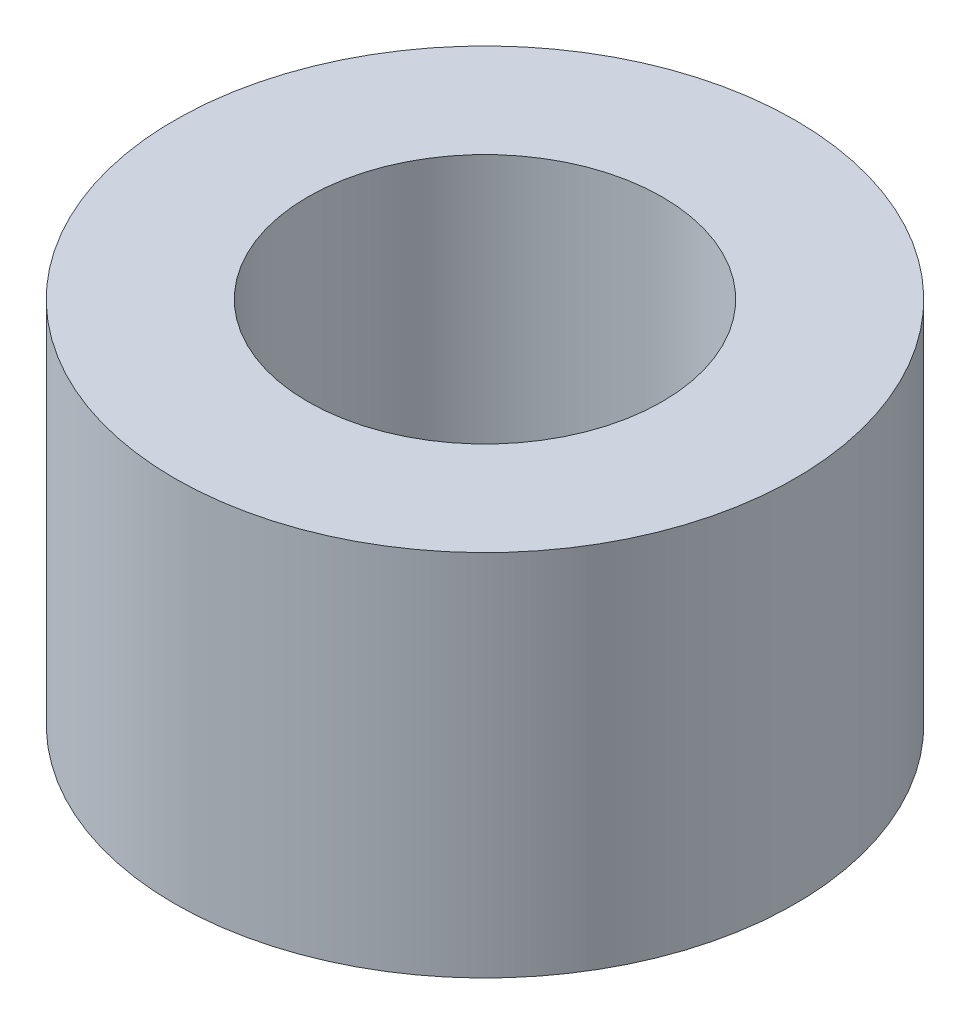
ISO-10303-21;
HEADER;
FILE_DESCRIPTION(('STEP AP214'),'2;1');
FILE_NAME('part.step','',(''),(''),'','','');
FILE_SCHEMA(('AUTOMOTIVE_DESIGN { 1 0 10303 214 1 1 1 1 }'));
ENDSEC;
DATA;
#1=APPLICATION_CONTEXT('core data for automotive mechanical design processes');
#2=APPLICATION_PROTOCOL_DEFINITION('international standard','automotive_design',2000,#1);
#3=PRODUCT_CONTEXT('',#1,'mechanical');
#4=PRODUCT('Part','Part','',(#3));
#5=PRODUCT_RELATED_PRODUCT_CATEGORY('part','',(#4));
#6=PRODUCT_DEFINITION_FORMATION('','',#4);
#7=PRODUCT_DEFINITION_CONTEXT('part definition',#1,'design');
#8=PRODUCT_DEFINITION('design','',#6,#7);
#9=PRODUCT_DEFINITION_SHAPE('','',#8);
#10=(LENGTH_UNIT() NAMED_UNIT(*) SI_UNIT(.MILLI.,.METRE.));
#11=(NAMED_UNIT(*) PLANE_ANGLE_UNIT() SI_UNIT($,.RADIAN.));
#12=(NAMED_UNIT(*) SI_UNIT($,.STERADIAN.) SOLID_ANGLE_UNIT());
#13=UNCERTAINTY_MEASURE_WITH_UNIT(LENGTH_MEASURE(1.E-05),#10,'distance_accuracy_value','');
#14=(GEOMETRIC_REPRESENTATION_CONTEXT(3) GLOBAL_UNCERTAINTY_ASSIGNED_CONTEXT((#13)) GLOBAL_UNIT_ASSIGNED_CONTEXT((#10,
#11,#12)) REPRESENTATION_CONTEXT('',''));
#15=CARTESIAN_POINT('',(0.,0.,0.));
#16=DIRECTION('',(0.,0.,1.));
#17=DIRECTION('',(1.,0.,0.));
#18=AXIS2_PLACEMENT_3D('',#15,#16,#17);
#19=CARTESIAN_POINT('',(0.,6.597899936,0.));
#20=DIRECTION('',(0.,-1.,0.));
#21=DIRECTION('',(0.,0.,-1.));
#22=AXIS2_PLACEMENT_3D('',#19,#20,#21);
#23=CYLINDRICAL_SURFACE('',#22,3.175);
#24=CARTESIAN_POINT('',(0.,0.,0.));
#25=DIRECTION('',(0.,-1.,0.));
#26=DIRECTION('',(0.,0.,-1.));
#27=AXIS2_PLACEMENT_3D('',#24,#25,#26);
#28=CIRCLE('',#27,3.175);
#29=CARTESIAN_POINT('',(0.,0.,-3.175));
#30=VERTEX_POINT('',#29);
#31=EDGE_CURVE('E27',#30,#30,#28,.T.);
#32=ORIENTED_EDGE('',*,*,#31,.T.);
#33=EDGE_LOOP('',(#32));
#34=FACE_BOUND('',#33,.T.);
#35=CARTESIAN_POINT('',(0.,6.597899936,0.));
#36=DIRECTION('',(0.,-1.,0.));
#37=DIRECTION('',(0.,0.,-1.));
#38=AXIS2_PLACEMENT_3D('',#35,#36,#37);
#39=CIRCLE('',#38,3.175);
#40=CARTESIAN_POINT('',(0.,6.597899936,-3.175));
#41=VERTEX_POINT('',#40);
#42=EDGE_CURVE('E18',#41,#41,#39,.T.);
#43=ORIENTED_EDGE('',*,*,#42,.F.);
#44=EDGE_LOOP('',(#43));
#45=FACE_BOUND('',#44,.T.);
#46=ADVANCED_FACE('F15',(#34,#45),#23,.F.);
#47=CARTESIAN_POINT('',(0.,6.597899936,0.));
#48=DIRECTION('',(0.,1.,0.));
#49=DIRECTION('',(0.,0.,1.));
#50=AXIS2_PLACEMENT_3D('',#47,#48,#49);
#51=PLANE('',#50);
#52=ORIENTED_EDGE('',*,*,#42,.T.);
#53=EDGE_LOOP('',(#52));
#54=FACE_BOUND('',#53,.T.);
#55=CARTESIAN_POINT('',(0.,6.597899936,0.));
#56=DIRECTION('',(0.,-1.,0.));
#57=DIRECTION('',(0.,0.,-1.));
#58=AXIS2_PLACEMENT_3D('',#55,#56,#57);
#59=CIRCLE('',#58,5.55625);
#60=CARTESIAN_POINT('',(0.,6.597899936,-5.55625));
#61=VERTEX_POINT('',#60);
#62=EDGE_CURVE('E22',#61,#61,#59,.T.);
#63=ORIENTED_EDGE('',*,*,#62,.F.);
#64=EDGE_LOOP('',(#63));
#65=FACE_BOUND('',#64,.T.);
#66=ADVANCED_FACE('F35',(#54,#65),#51,.T.);
#67=CARTESIAN_POINT('',(0.,0.,0.));
#68=DIRECTION('',(0.,1.,0.));
#69=DIRECTION('',(0.,0.,1.));
#70=AXIS2_PLACEMENT_3D('',#67,#68,#69);
#71=PLANE('',#70);
#72=ORIENTED_EDGE('',*,*,#31,.F.);
#73=EDGE_LOOP('',(#72));
#74=FACE_BOUND('',#73,.T.);
#75=CARTESIAN_POINT('',(0.,0.,0.));
#76=DIRECTION('',(0.,-1.,0.));
#77=DIRECTION('',(0.,0.,-1.));
#78=AXIS2_PLACEMENT_3D('',#75,#76,#77);
#79=CIRCLE('',#78,5.55625);
#80=CARTESIAN_POINT('',(0.,0.,-5.55625));
#81=VERTEX_POINT('',#80);
#82=EDGE_CURVE('E10',#81,#81,#79,.F.);
#83=ORIENTED_EDGE('',*,*,#82,.F.);
#84=EDGE_LOOP('',(#83));
#85=FACE_BOUND('',#84,.T.);
#86=ADVANCED_FACE('F43',(#74,#85),#71,.F.);
#87=CARTESIAN_POINT('',(0.,6.597899936,0.));
#88=DIRECTION('',(0.,-1.,0.));
#89=DIRECTION('',(0.,0.,-1.));
#90=AXIS2_PLACEMENT_3D('',#87,#88,#89);
#91=CYLINDRICAL_SURFACE('',#90,5.55625);
#92=ORIENTED_EDGE('',*,*,#82,.T.);
#93=EDGE_LOOP('',(#92));
#94=FACE_BOUND('',#93,.T.);
#95=ORIENTED_EDGE('',*,*,#62,.T.);
#96=EDGE_LOOP('',(#95));
#97=FACE_BOUND('',#96,.T.);
#98=ADVANCED_FACE('F44',(#94,#97),#91,.T.);
#99=CLOSED_SHELL('',(#46,#66,#86,#98));
#100=MANIFOLD_SOLID_BREP('B1',#99);
#101=ADVANCED_BREP_SHAPE_REPRESENTATION('',(#18,#100),#14);
#102=SHAPE_DEFINITION_REPRESENTATION(#9,#101);
ENDSEC;
END-ISO-10303-21;
